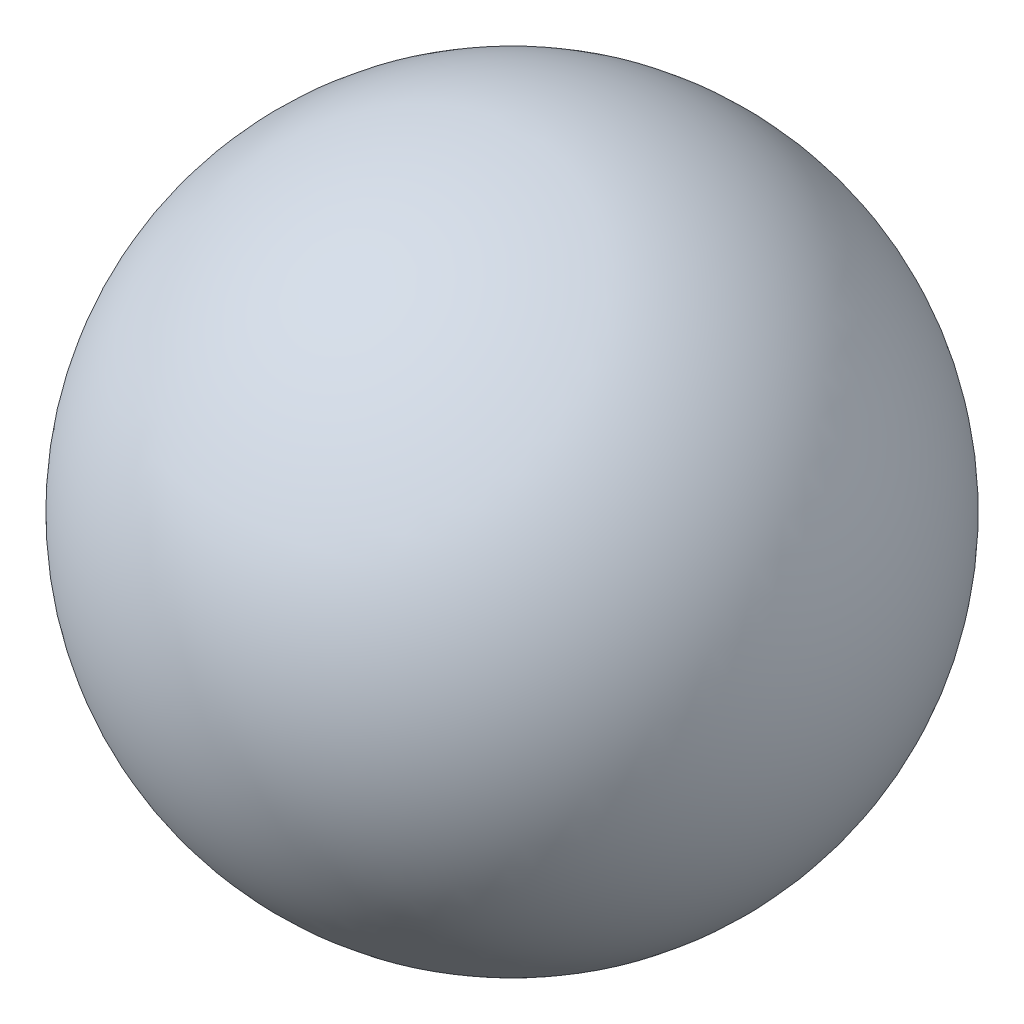
ISO-10303-21;
HEADER;
FILE_DESCRIPTION(('STEP AP214'),'2;1');
FILE_NAME('part.step','',(''),(''),'','','');
FILE_SCHEMA(('AUTOMOTIVE_DESIGN { 1 0 10303 214 1 1 1 1 }'));
ENDSEC;
DATA;
#1=APPLICATION_CONTEXT('core data for automotive mechanical design processes');
#2=APPLICATION_PROTOCOL_DEFINITION('international standard','automotive_design',2000,#1);
#3=PRODUCT_CONTEXT('',#1,'mechanical');
#4=PRODUCT('Part','Part','',(#3));
#5=PRODUCT_RELATED_PRODUCT_CATEGORY('part','',(#4));
#6=PRODUCT_DEFINITION_FORMATION('','',#4);
#7=PRODUCT_DEFINITION_CONTEXT('part definition',#1,'design');
#8=PRODUCT_DEFINITION('design','',#6,#7);
#9=PRODUCT_DEFINITION_SHAPE('','',#8);
#10=(LENGTH_UNIT() NAMED_UNIT(*) SI_UNIT(.MILLI.,.METRE.));
#11=(NAMED_UNIT(*) PLANE_ANGLE_UNIT() SI_UNIT($,.RADIAN.));
#12=(NAMED_UNIT(*) SI_UNIT($,.STERADIAN.) SOLID_ANGLE_UNIT());
#13=UNCERTAINTY_MEASURE_WITH_UNIT(LENGTH_MEASURE(1.E-05),#10,'distance_accuracy_value','');
#14=(GEOMETRIC_REPRESENTATION_CONTEXT(3) GLOBAL_UNCERTAINTY_ASSIGNED_CONTEXT((#13)) GLOBAL_UNIT_ASSIGNED_CONTEXT((#10,
#11,#12)) REPRESENTATION_CONTEXT('',''));
#15=CARTESIAN_POINT('',(0.,0.,0.));
#16=DIRECTION('',(0.,0.,1.));
#17=DIRECTION('',(1.,0.,0.));
#18=AXIS2_PLACEMENT_3D('',#15,#16,#17);
#19=CARTESIAN_POINT('',(0.,0.,0.));
#20=DIRECTION('',(0.,1.,0.));
#21=DIRECTION('',(1.,0.,0.));
#22=AXIS2_PLACEMENT_3D('',#19,#20,#21);
#23=SPHERICAL_SURFACE('',#22,123.);
#24=CARTESIAN_POINT('',(0.,123.,0.));
#25=VERTEX_POINT('',#24);
#26=VERTEX_LOOP('',#25);
#27=FACE_BOUND('',#26,.T.);
#28=ADVANCED_FACE('F31',(#27),#23,.T.);
#29=CLOSED_SHELL('',(#28));
#30=MANIFOLD_SOLID_BREP('B2',#29);
#31=ADVANCED_BREP_SHAPE_REPRESENTATION('',(#18,#30),#14);
#32=SHAPE_DEFINITION_REPRESENTATION(#9,#31);
ENDSEC;
END-ISO-10303-21;
